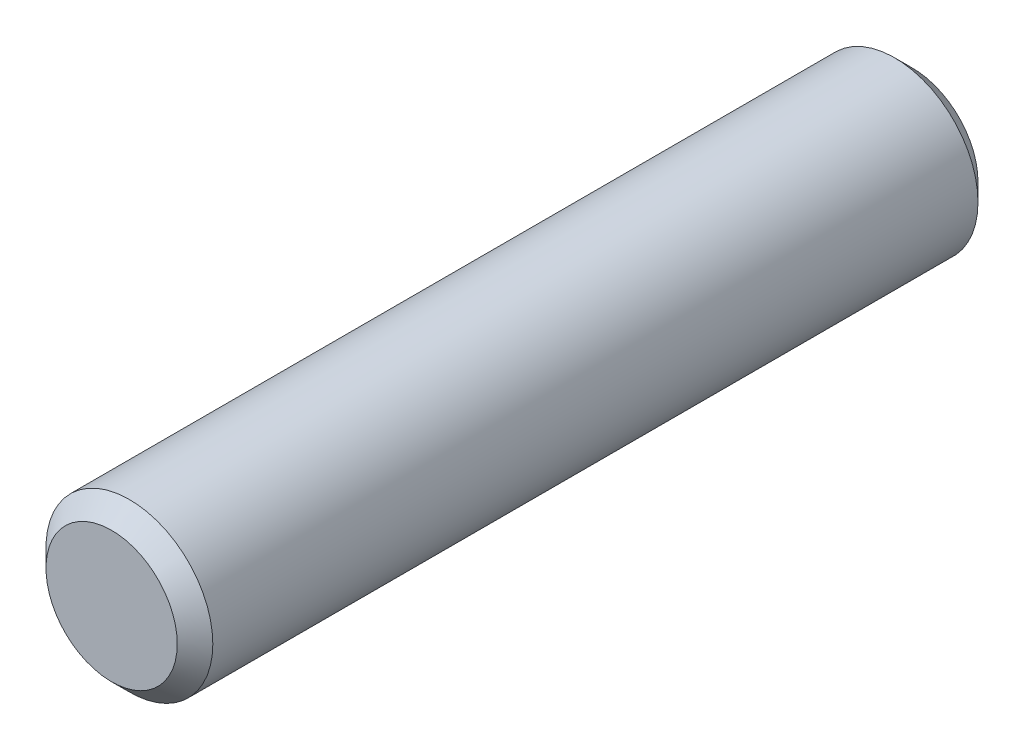
ISO-10303-21;
HEADER;
FILE_DESCRIPTION(('STEP AP214'),'2;1');
FILE_NAME('part.step','',(''),(''),'','','');
FILE_SCHEMA(('AUTOMOTIVE_DESIGN { 1 0 10303 214 1 1 1 1 }'));
ENDSEC;
DATA;
#1=APPLICATION_CONTEXT('core data for automotive mechanical design processes');
#2=APPLICATION_PROTOCOL_DEFINITION('international standard','automotive_design',2000,#1);
#3=PRODUCT_CONTEXT('',#1,'mechanical');
#4=PRODUCT('Part','Part','',(#3));
#5=PRODUCT_RELATED_PRODUCT_CATEGORY('part','',(#4));
#6=PRODUCT_DEFINITION_FORMATION('','',#4);
#7=PRODUCT_DEFINITION_CONTEXT('part definition',#1,'design');
#8=PRODUCT_DEFINITION('design','',#6,#7);
#9=PRODUCT_DEFINITION_SHAPE('','',#8);
#10=(LENGTH_UNIT() NAMED_UNIT(*) SI_UNIT(.MILLI.,.METRE.));
#11=(NAMED_UNIT(*) PLANE_ANGLE_UNIT() SI_UNIT($,.RADIAN.));
#12=(NAMED_UNIT(*) SI_UNIT($,.STERADIAN.) SOLID_ANGLE_UNIT());
#13=UNCERTAINTY_MEASURE_WITH_UNIT(LENGTH_MEASURE(1.E-05),#10,'distance_accuracy_value','');
#14=(GEOMETRIC_REPRESENTATION_CONTEXT(3) GLOBAL_UNCERTAINTY_ASSIGNED_CONTEXT((#13)) GLOBAL_UNIT_ASSIGNED_CONTEXT((#10,
#11,#12)) REPRESENTATION_CONTEXT('',''));
#15=CARTESIAN_POINT('',(0.,0.,0.));
#16=DIRECTION('',(0.,0.,1.));
#17=DIRECTION('',(1.,0.,0.));
#18=AXIS2_PLACEMENT_3D('',#15,#16,#17);
#19=CARTESIAN_POINT('',(0.,0.,5.715));
#20=DIRECTION('',(0.,0.,-1.));
#21=DIRECTION('',(-1.,0.,0.));
#22=AXIS2_PLACEMENT_3D('',#19,#20,#21);
#23=CYLINDRICAL_SURFACE('',#22,1.190625);
#24=CARTESIAN_POINT('',(0.,0.,-5.461));
#25=DIRECTION('',(0.,0.,1.));
#26=DIRECTION('',(1.,0.,0.));
#27=AXIS2_PLACEMENT_3D('',#24,#25,#26);
#28=CIRCLE('',#27,1.190625);
#29=CARTESIAN_POINT('',(1.190625,0.,-5.461));
#30=VERTEX_POINT('',#29);
#31=EDGE_CURVE('E383',#30,#30,#28,.T.);
#32=ORIENTED_EDGE('',*,*,#31,.T.);
#33=EDGE_LOOP('',(#32));
#34=FACE_BOUND('',#33,.T.);
#35=CARTESIAN_POINT('',(0.,0.,5.461));
#36=DIRECTION('',(0.,0.,1.));
#37=DIRECTION('',(1.,0.,0.));
#38=AXIS2_PLACEMENT_3D('',#35,#36,#37);
#39=CIRCLE('',#38,1.190625);
#40=CARTESIAN_POINT('',(1.190625,0.,5.461));
#41=VERTEX_POINT('',#40);
#42=EDGE_CURVE('E387',#41,#41,#39,.F.);
#43=ORIENTED_EDGE('',*,*,#42,.T.);
#44=EDGE_LOOP('',(#43));
#45=FACE_BOUND('',#44,.T.);
#46=ADVANCED_FACE('F373',(#34,#45),#23,.T.);
#47=CARTESIAN_POINT('',(0.,0.,5.715));
#48=DIRECTION('',(0.,0.,1.));
#49=DIRECTION('',(1.,0.,0.));
#50=AXIS2_PLACEMENT_3D('',#47,#48,#49);
#51=PLANE('',#50);
#52=CARTESIAN_POINT('',(0.,0.,5.715));
#53=DIRECTION('',(0.,0.,1.));
#54=DIRECTION('',(1.,0.,0.));
#55=AXIS2_PLACEMENT_3D('',#52,#53,#54);
#56=CIRCLE('',#55,0.936625);
#57=CARTESIAN_POINT('',(0.936625,0.,5.715));
#58=VERTEX_POINT('',#57);
#59=EDGE_CURVE('E10',#58,#58,#56,.T.);
#60=ORIENTED_EDGE('',*,*,#59,.T.);
#61=EDGE_LOOP('',(#60));
#62=FACE_BOUND('',#61,.T.);
#63=ADVANCED_FACE('F406',(#62),#51,.T.);
#64=CARTESIAN_POINT('',(0.,0.,-5.715));
#65=DIRECTION('',(0.,0.,1.));
#66=DIRECTION('',(1.,0.,0.));
#67=AXIS2_PLACEMENT_3D('',#64,#65,#66);
#68=PLANE('',#67);
#69=CARTESIAN_POINT('',(0.,0.,-5.715));
#70=DIRECTION('',(0.,0.,1.));
#71=DIRECTION('',(1.,0.,0.));
#72=AXIS2_PLACEMENT_3D('',#69,#70,#71);
#73=CIRCLE('',#72,0.936624999999999);
#74=CARTESIAN_POINT('',(0.936624999999999,0.,-5.715));
#75=VERTEX_POINT('',#74);
#76=EDGE_CURVE('E379',#75,#75,#73,.F.);
#77=ORIENTED_EDGE('',*,*,#76,.T.);
#78=EDGE_LOOP('',(#77));
#79=FACE_BOUND('',#78,.T.);
#80=ADVANCED_FACE('F402',(#79),#68,.F.);
#81=CARTESIAN_POINT('',(0.,0.,-5.461));
#82=DIRECTION('',(0.,0.,1.));
#83=DIRECTION('',(1.,0.,0.));
#84=AXIS2_PLACEMENT_3D('',#81,#82,#83);
#85=CONICAL_SURFACE('',#84,1.190625,0.785398163397449);
#86=ORIENTED_EDGE('',*,*,#76,.F.);
#87=EDGE_LOOP('',(#86));
#88=FACE_BOUND('',#87,.T.);
#89=ORIENTED_EDGE('',*,*,#31,.F.);
#90=EDGE_LOOP('',(#89));
#91=FACE_BOUND('',#90,.T.);
#92=ADVANCED_FACE('F397',(#88,#91),#85,.T.);
#93=CARTESIAN_POINT('',(0.,0.,5.715));
#94=DIRECTION('',(0.,0.,-1.));
#95=DIRECTION('',(-1.,0.,0.));
#96=AXIS2_PLACEMENT_3D('',#93,#94,#95);
#97=CONICAL_SURFACE('',#96,0.936625,0.785398163397446);
#98=ORIENTED_EDGE('',*,*,#42,.F.);
#99=EDGE_LOOP('',(#98));
#100=FACE_BOUND('',#99,.T.);
#101=ORIENTED_EDGE('',*,*,#59,.F.);
#102=EDGE_LOOP('',(#101));
#103=FACE_BOUND('',#102,.T.);
#104=ADVANCED_FACE('F394',(#100,#103),#97,.T.);
#105=CLOSED_SHELL('',(#46,#63,#80,#92,#104));
#106=MANIFOLD_SOLID_BREP('B2',#105);
#107=ADVANCED_BREP_SHAPE_REPRESENTATION('',(#18,#106),#14);
#108=SHAPE_DEFINITION_REPRESENTATION(#9,#107);
ENDSEC;
END-ISO-10303-21;
